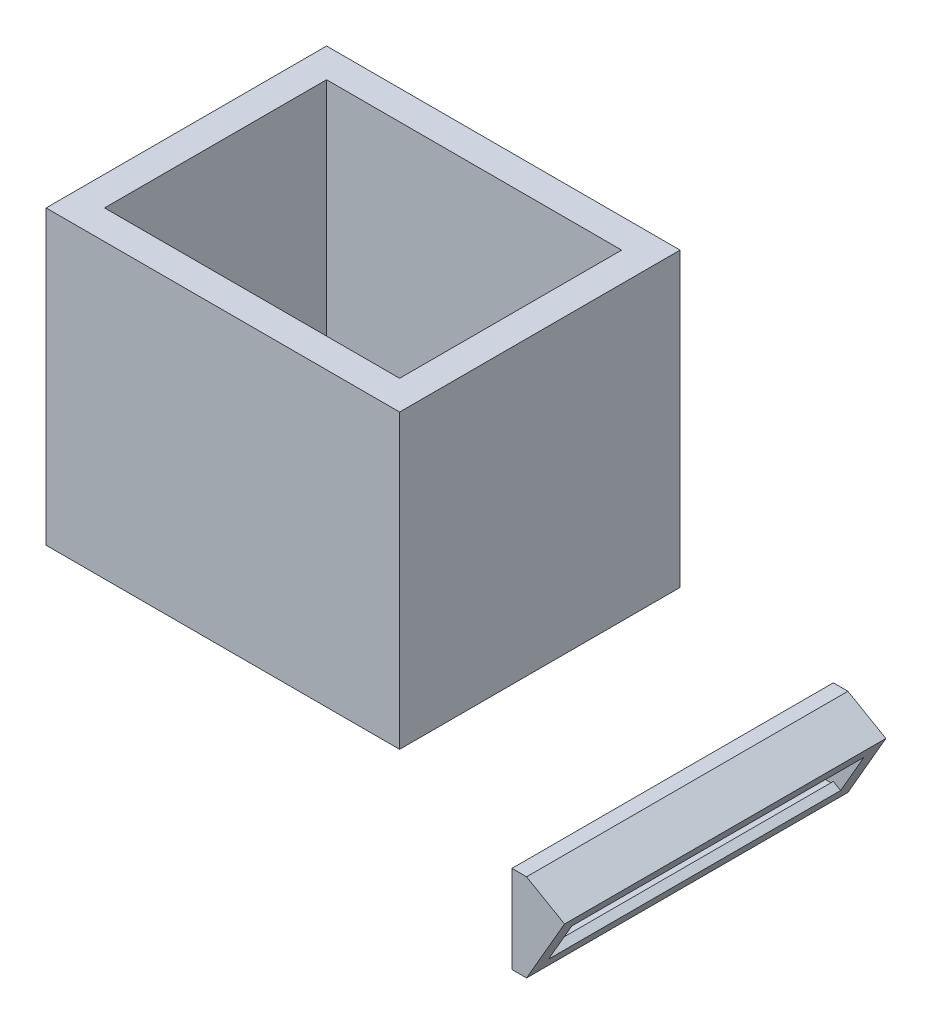
ISO-10303-21;
HEADER;
FILE_DESCRIPTION(('STEP AP214'),'2;1');
FILE_NAME('part.step','',(''),(''),'','','');
FILE_SCHEMA(('AUTOMOTIVE_DESIGN { 1 0 10303 214 1 1 1 1 }'));
ENDSEC;
DATA;
#1=APPLICATION_CONTEXT('core data for automotive mechanical design processes');
#2=APPLICATION_PROTOCOL_DEFINITION('international standard','automotive_design',2000,#1);
#3=PRODUCT_CONTEXT('',#1,'mechanical');
#4=PRODUCT('Part','Part','',(#3));
#5=PRODUCT_RELATED_PRODUCT_CATEGORY('part','',(#4));
#6=PRODUCT_DEFINITION_FORMATION('','',#4);
#7=PRODUCT_DEFINITION_CONTEXT('part definition',#1,'design');
#8=PRODUCT_DEFINITION('design','',#6,#7);
#9=PRODUCT_DEFINITION_SHAPE('','',#8);
#10=(LENGTH_UNIT() NAMED_UNIT(*) SI_UNIT(.MILLI.,.METRE.));
#11=(NAMED_UNIT(*) PLANE_ANGLE_UNIT() SI_UNIT($,.RADIAN.));
#12=(NAMED_UNIT(*) SI_UNIT($,.STERADIAN.) SOLID_ANGLE_UNIT());
#13=UNCERTAINTY_MEASURE_WITH_UNIT(LENGTH_MEASURE(1.E-05),#10,'distance_accuracy_value','');
#14=(GEOMETRIC_REPRESENTATION_CONTEXT(3) GLOBAL_UNCERTAINTY_ASSIGNED_CONTEXT((#13)) GLOBAL_UNIT_ASSIGNED_CONTEXT((#10,
#11,#12)) REPRESENTATION_CONTEXT('',''));
#15=CARTESIAN_POINT('',(0.,0.,0.));
#16=DIRECTION('',(0.,0.,1.));
#17=DIRECTION('',(1.,0.,0.));
#18=AXIS2_PLACEMENT_3D('',#15,#16,#17);
#19=CARTESIAN_POINT('',(3.,0.,0.));
#20=DIRECTION('',(-1.,0.,0.));
#21=DIRECTION('',(0.,0.,1.));
#22=AXIS2_PLACEMENT_3D('',#19,#20,#21);
#23=PLANE('',#22);
#24=DIRECTION('',(0.,1.,0.));
#25=VECTOR('',#24,1.);
#26=CARTESIAN_POINT('',(3.,-26.,-29.1899634390391));
#27=LINE('',#26,#25);
#28=CARTESIAN_POINT('',(3.,-26.,-29.1899634390391));
#29=VERTEX_POINT('',#28);
#30=CARTESIAN_POINT('',(3.,-20.,-29.1899634390391));
#31=VERTEX_POINT('',#30);
#32=EDGE_CURVE('E171',#29,#31,#27,.T.);
#33=ORIENTED_EDGE('',*,*,#32,.F.);
#34=DIRECTION('',(0.,0.,-1.));
#35=VECTOR('',#34,1.);
#36=CARTESIAN_POINT('',(3.,-26.,-7.1899634390391));
#37=LINE('',#36,#35);
#38=CARTESIAN_POINT('',(3.,-26.,-7.1899634390391));
#39=VERTEX_POINT('',#38);
#40=EDGE_CURVE('E87',#39,#29,#37,.T.);
#41=ORIENTED_EDGE('',*,*,#40,.F.);
#42=DIRECTION('',(0.,-1.,0.));
#43=VECTOR('',#42,1.);
#44=CARTESIAN_POINT('',(3.,-26.,-7.1899634390391));
#45=LINE('',#44,#43);
#46=CARTESIAN_POINT('',(3.,-20.,-7.1899634390391));
#47=VERTEX_POINT('',#46);
#48=EDGE_CURVE('E176',#47,#39,#45,.T.);
#49=ORIENTED_EDGE('',*,*,#48,.F.);
#50=DIRECTION('',(0.,0.,1.));
#51=VECTOR('',#50,1.);
#52=CARTESIAN_POINT('',(3.,-20.,-7.1899634390391));
#53=LINE('',#52,#51);
#54=EDGE_CURVE('E173',#31,#47,#53,.T.);
#55=ORIENTED_EDGE('',*,*,#54,.F.);
#56=EDGE_LOOP('',(#33,#41,#49,#55));
#57=FACE_BOUND('',#56,.T.);
#58=DIRECTION('',(0.,0.,-1.));
#59=VECTOR('',#58,1.);
#60=CARTESIAN_POINT('',(3.,-25.,-8.18996343903912));
#61=LINE('',#60,#59);
#62=CARTESIAN_POINT('',(3.,-25.,-8.18996343903912));
#63=VERTEX_POINT('',#62);
#64=CARTESIAN_POINT('',(3.,-25.,-28.1899634390391));
#65=VERTEX_POINT('',#64);
#66=EDGE_CURVE('E228',#63,#65,#61,.T.);
#67=ORIENTED_EDGE('',*,*,#66,.T.);
#68=DIRECTION('',(0.,1.,0.));
#69=VECTOR('',#68,1.);
#70=CARTESIAN_POINT('',(3.,-25.,-28.1899634390391));
#71=LINE('',#70,#69);
#72=CARTESIAN_POINT('',(3.,-21.,-28.1899634390391));
#73=VERTEX_POINT('',#72);
#74=EDGE_CURVE('E58',#65,#73,#71,.T.);
#75=ORIENTED_EDGE('',*,*,#74,.T.);
#76=DIRECTION('',(0.,0.,1.));
#77=VECTOR('',#76,1.);
#78=CARTESIAN_POINT('',(3.,-21.,-8.18996343903912));
#79=LINE('',#78,#77);
#80=CARTESIAN_POINT('',(3.,-21.,-8.18996343903912));
#81=VERTEX_POINT('',#80);
#82=EDGE_CURVE('E222',#73,#81,#79,.T.);
#83=ORIENTED_EDGE('',*,*,#82,.T.);
#84=DIRECTION('',(0.,-1.,0.));
#85=VECTOR('',#84,1.);
#86=CARTESIAN_POINT('',(3.,-25.,-8.18996343903912));
#87=LINE('',#86,#85);
#88=EDGE_CURVE('E225',#81,#63,#87,.T.);
#89=ORIENTED_EDGE('',*,*,#88,.T.);
#90=EDGE_LOOP('',(#67,#75,#83,#89));
#91=FACE_BOUND('',#90,.T.);
#92=ADVANCED_FACE('F43',(#57,#91),#23,.T.);
#93=CARTESIAN_POINT('',(4.,-26.,-29.1899634390391));
#94=DIRECTION('',(0.,0.,1.));
#95=DIRECTION('',(1.,0.,0.));
#96=AXIS2_PLACEMENT_3D('',#93,#94,#95);
#97=PLANE('',#96);
#98=ORIENTED_EDGE('',*,*,#32,.T.);
#99=DIRECTION('',(-1.,0.,0.));
#100=VECTOR('',#99,1.);
#101=CARTESIAN_POINT('',(4.,-20.,-29.1899634390391));
#102=LINE('',#101,#100);
#103=CARTESIAN_POINT('',(4.,-20.,-29.1899634390391));
#104=VERTEX_POINT('',#103);
#105=EDGE_CURVE('E12',#104,#31,#102,.T.);
#106=ORIENTED_EDGE('',*,*,#105,.F.);
#107=DIRECTION('',(0.866025403784438,-0.500000000000001,0.));
#108=VECTOR('',#107,1.);
#109=CARTESIAN_POINT('',(-15.7920024250066,-8.57308207212069,-29.1899634390391));
#110=LINE('',#109,#108);
#111=CARTESIAN_POINT('',(6.59807621135332,-21.5,-29.1899634390391));
#112=VERTEX_POINT('',#111);
#113=EDGE_CURVE('E159',#104,#112,#110,.T.);
#114=ORIENTED_EDGE('',*,*,#113,.T.);
#115=DIRECTION('',(0.500000000000001,0.866025403784438,0.));
#116=VECTOR('',#115,1.);
#117=CARTESIAN_POINT('',(4.,-26.,-29.1899634390391));
#118=LINE('',#117,#116);
#119=CARTESIAN_POINT('',(4.,-26.,-29.1899634390391));
#120=VERTEX_POINT('',#119);
#121=EDGE_CURVE('E157',#120,#112,#118,.T.);
#122=ORIENTED_EDGE('',*,*,#121,.F.);
#123=DIRECTION('',(-1.,0.,0.));
#124=VECTOR('',#123,1.);
#125=CARTESIAN_POINT('',(4.,-26.,-29.1899634390391));
#126=LINE('',#125,#124);
#127=EDGE_CURVE('E146',#120,#29,#126,.T.);
#128=ORIENTED_EDGE('',*,*,#127,.T.);
#129=EDGE_LOOP('',(#98,#106,#114,#122,#128));
#130=FACE_BOUND('',#129,.T.);
#131=ADVANCED_FACE('F45',(#130),#97,.F.);
#132=CARTESIAN_POINT('',(4.,-20.,-7.1899634390391));
#133=DIRECTION('',(0.,-1.,0.));
#134=DIRECTION('',(0.,0.,-1.));
#135=AXIS2_PLACEMENT_3D('',#132,#133,#134);
#136=PLANE('',#135);
#137=ORIENTED_EDGE('',*,*,#54,.T.);
#138=DIRECTION('',(-1.,0.,0.));
#139=VECTOR('',#138,1.);
#140=CARTESIAN_POINT('',(4.,-20.,-7.1899634390391));
#141=LINE('',#140,#139);
#142=CARTESIAN_POINT('',(4.,-20.,-7.1899634390391));
#143=VERTEX_POINT('',#142);
#144=EDGE_CURVE('E51',#143,#47,#141,.T.);
#145=ORIENTED_EDGE('',*,*,#144,.F.);
#146=DIRECTION('',(0.,0.,1.));
#147=VECTOR('',#146,1.);
#148=CARTESIAN_POINT('',(4.,-20.,-7.1899634390391));
#149=LINE('',#148,#147);
#150=EDGE_CURVE('E92',#104,#143,#149,.T.);
#151=ORIENTED_EDGE('',*,*,#150,.F.);
#152=ORIENTED_EDGE('',*,*,#105,.T.);
#153=EDGE_LOOP('',(#137,#145,#151,#152));
#154=FACE_BOUND('',#153,.T.);
#155=ADVANCED_FACE('F291',(#154),#136,.F.);
#156=CARTESIAN_POINT('',(4.,-26.,-7.1899634390391));
#157=DIRECTION('',(0.,0.,-1.));
#158=DIRECTION('',(0.,1.,0.));
#159=AXIS2_PLACEMENT_3D('',#156,#157,#158);
#160=PLANE('',#159);
#161=ORIENTED_EDGE('',*,*,#48,.T.);
#162=DIRECTION('',(-1.,0.,0.));
#163=VECTOR('',#162,1.);
#164=CARTESIAN_POINT('',(4.,-26.,-7.1899634390391));
#165=LINE('',#164,#163);
#166=CARTESIAN_POINT('',(4.,-26.,-7.1899634390391));
#167=VERTEX_POINT('',#166);
#168=EDGE_CURVE('E67',#167,#39,#165,.T.);
#169=ORIENTED_EDGE('',*,*,#168,.F.);
#170=DIRECTION('',(-0.500000000000001,-0.866025403784438,0.));
#171=VECTOR('',#170,1.);
#172=CARTESIAN_POINT('',(4.,-26.,-7.1899634390391));
#173=LINE('',#172,#171);
#174=CARTESIAN_POINT('',(6.59807621135332,-21.5,-7.1899634390391));
#175=VERTEX_POINT('',#174);
#176=EDGE_CURVE('E164',#175,#167,#173,.T.);
#177=ORIENTED_EDGE('',*,*,#176,.F.);
#178=DIRECTION('',(0.866025403784438,-0.500000000000001,0.));
#179=VECTOR('',#178,1.);
#180=CARTESIAN_POINT('',(-15.7920024250066,-8.57308207212069,-7.18996343903911));
#181=LINE('',#180,#179);
#182=EDGE_CURVE('E183',#143,#175,#181,.T.);
#183=ORIENTED_EDGE('',*,*,#182,.F.);
#184=ORIENTED_EDGE('',*,*,#144,.T.);
#185=EDGE_LOOP('',(#161,#169,#177,#183,#184));
#186=FACE_BOUND('',#185,.T.);
#187=ADVANCED_FACE('F182',(#186),#160,.F.);
#188=CARTESIAN_POINT('',(4.,-26.,-7.1899634390391));
#189=DIRECTION('',(0.,1.,0.));
#190=DIRECTION('',(0.,0.,1.));
#191=AXIS2_PLACEMENT_3D('',#188,#189,#190);
#192=PLANE('',#191);
#193=ORIENTED_EDGE('',*,*,#40,.T.);
#194=ORIENTED_EDGE('',*,*,#127,.F.);
#195=DIRECTION('',(0.,0.,-1.));
#196=VECTOR('',#195,1.);
#197=CARTESIAN_POINT('',(4.,-26.,-7.1899634390391));
#198=LINE('',#197,#196);
#199=EDGE_CURVE('E150',#167,#120,#198,.T.);
#200=ORIENTED_EDGE('',*,*,#199,.F.);
#201=ORIENTED_EDGE('',*,*,#168,.T.);
#202=EDGE_LOOP('',(#193,#194,#200,#201));
#203=FACE_BOUND('',#202,.T.);
#204=ADVANCED_FACE('F148',(#203),#192,.F.);
#205=CARTESIAN_POINT('',(4.,-25.,-28.1899634390391));
#206=DIRECTION('',(0.,0.,1.));
#207=DIRECTION('',(1.,0.,0.));
#208=AXIS2_PLACEMENT_3D('',#205,#206,#207);
#209=PLANE('',#208);
#210=ORIENTED_EDGE('',*,*,#74,.F.);
#211=DIRECTION('',(-1.,0.,0.));
#212=VECTOR('',#211,1.);
#213=CARTESIAN_POINT('',(4.,-25.,-28.1899634390391));
#214=LINE('',#213,#212);
#215=CARTESIAN_POINT('',(4.,-25.,-28.1899634390391));
#216=VERTEX_POINT('',#215);
#217=EDGE_CURVE('E220',#216,#65,#214,.T.);
#218=ORIENTED_EDGE('',*,*,#217,.F.);
#219=DIRECTION('',(0.,1.,0.));
#220=VECTOR('',#219,1.);
#221=CARTESIAN_POINT('',(4.,-25.,-28.1899634390391));
#222=LINE('',#221,#220);
#223=CARTESIAN_POINT('',(4.,-24.8452994616208,-28.1899634390391));
#224=VERTEX_POINT('',#223);
#225=EDGE_CURVE('E206',#216,#224,#222,.T.);
#226=ORIENTED_EDGE('',*,*,#225,.T.);
#227=DIRECTION('',(0.866025403784438,-0.500000000000001,0.));
#228=VECTOR('',#227,1.);
#229=CARTESIAN_POINT('',(-17.8900786363599,-12.2070566683362,-28.1899634390391));
#230=LINE('',#229,#228);
#231=CARTESIAN_POINT('',(4.5,-25.1339745962156,-28.1899634390391));
#232=VERTEX_POINT('',#231);
#233=EDGE_CURVE('E200',#224,#232,#230,.T.);
#234=ORIENTED_EDGE('',*,*,#233,.T.);
#235=DIRECTION('',(0.500000000000001,0.866025403784438,0.));
#236=VECTOR('',#235,1.);
#237=CARTESIAN_POINT('',(4.5,-25.1339745962156,-28.1899634390391));
#238=LINE('',#237,#236);
#239=CARTESIAN_POINT('',(6.09807621135332,-22.3660254037844,-28.1899634390391));
#240=VERTEX_POINT('',#239);
#241=EDGE_CURVE('E199',#232,#240,#238,.T.);
#242=ORIENTED_EDGE('',*,*,#241,.T.);
#243=DIRECTION('',(0.866025403784438,-0.500000000000001,0.));
#244=VECTOR('',#243,1.);
#245=CARTESIAN_POINT('',(-16.2920024250066,-9.43910747590512,-28.1899634390391));
#246=LINE('',#245,#244);
#247=CARTESIAN_POINT('',(4.,-21.1547005383792,-28.1899634390391));
#248=VERTEX_POINT('',#247);
#249=EDGE_CURVE('E197',#248,#240,#246,.T.);
#250=ORIENTED_EDGE('',*,*,#249,.F.);
#251=CARTESIAN_POINT('',(4.,-21.,-28.1899634390391));
#252=VERTEX_POINT('',#251);
#253=EDGE_CURVE('E210',#248,#252,#222,.T.);
#254=ORIENTED_EDGE('',*,*,#253,.T.);
#255=DIRECTION('',(-1.,0.,0.));
#256=VECTOR('',#255,1.);
#257=CARTESIAN_POINT('',(4.,-21.,-28.1899634390391));
#258=LINE('',#257,#256);
#259=EDGE_CURVE('E174',#252,#73,#258,.T.);
#260=ORIENTED_EDGE('',*,*,#259,.T.);
#261=EDGE_LOOP('',(#210,#218,#226,#234,#242,#250,#254,#260));
#262=FACE_BOUND('',#261,.T.);
#263=ADVANCED_FACE('F237',(#262),#209,.T.);
#264=CARTESIAN_POINT('',(4.,-21.,-8.18996343903912));
#265=DIRECTION('',(0.,-1.,0.));
#266=DIRECTION('',(0.,0.,-1.));
#267=AXIS2_PLACEMENT_3D('',#264,#265,#266);
#268=PLANE('',#267);
#269=ORIENTED_EDGE('',*,*,#82,.F.);
#270=ORIENTED_EDGE('',*,*,#259,.F.);
#271=DIRECTION('',(0.,0.,1.));
#272=VECTOR('',#271,1.);
#273=CARTESIAN_POINT('',(4.,-21.,-8.18996343903912));
#274=LINE('',#273,#272);
#275=CARTESIAN_POINT('',(4.,-21.,-8.18996343903912));
#276=VERTEX_POINT('',#275);
#277=EDGE_CURVE('E209',#252,#276,#274,.T.);
#278=ORIENTED_EDGE('',*,*,#277,.T.);
#279=DIRECTION('',(-1.,0.,0.));
#280=VECTOR('',#279,1.);
#281=CARTESIAN_POINT('',(4.,-21.,-8.18996343903912));
#282=LINE('',#281,#280);
#283=EDGE_CURVE('E234',#276,#81,#282,.T.);
#284=ORIENTED_EDGE('',*,*,#283,.T.);
#285=EDGE_LOOP('',(#269,#270,#278,#284));
#286=FACE_BOUND('',#285,.T.);
#287=ADVANCED_FACE('F277',(#286),#268,.T.);
#288=CARTESIAN_POINT('',(4.,-25.,-8.18996343903912));
#289=DIRECTION('',(0.,0.,-1.));
#290=DIRECTION('',(-1.,0.,0.));
#291=AXIS2_PLACEMENT_3D('',#288,#289,#290);
#292=PLANE('',#291);
#293=ORIENTED_EDGE('',*,*,#88,.F.);
#294=ORIENTED_EDGE('',*,*,#283,.F.);
#295=DIRECTION('',(0.,-1.,0.));
#296=VECTOR('',#295,1.);
#297=CARTESIAN_POINT('',(4.,-25.,-8.18996343903912));
#298=LINE('',#297,#296);
#299=CARTESIAN_POINT('',(4.,-21.1547005383792,-8.1899634390391));
#300=VERTEX_POINT('',#299);
#301=EDGE_CURVE('E214',#276,#300,#298,.T.);
#302=ORIENTED_EDGE('',*,*,#301,.T.);
#303=DIRECTION('',(0.866025403784438,-0.500000000000001,0.));
#304=VECTOR('',#303,1.);
#305=CARTESIAN_POINT('',(-16.2920024250066,-9.43910747590512,-8.1899634390391));
#306=LINE('',#305,#304);
#307=CARTESIAN_POINT('',(6.09807621135332,-22.3660254037844,-8.1899634390391));
#308=VERTEX_POINT('',#307);
#309=EDGE_CURVE('E193',#300,#308,#306,.T.);
#310=ORIENTED_EDGE('',*,*,#309,.T.);
#311=DIRECTION('',(-0.500000000000002,-0.866025403784438,0.));
#312=VECTOR('',#311,1.);
#313=CARTESIAN_POINT('',(4.5,-25.1339745962156,-8.1899634390391));
#314=LINE('',#313,#312);
#315=CARTESIAN_POINT('',(4.5,-25.1339745962156,-8.1899634390391));
#316=VERTEX_POINT('',#315);
#317=EDGE_CURVE('E195',#308,#316,#314,.T.);
#318=ORIENTED_EDGE('',*,*,#317,.T.);
#319=DIRECTION('',(0.866025403784438,-0.500000000000001,0.));
#320=VECTOR('',#319,1.);
#321=CARTESIAN_POINT('',(-17.8900786363599,-12.2070566683362,-8.1899634390391));
#322=LINE('',#321,#320);
#323=CARTESIAN_POINT('',(4.,-24.8452994616207,-8.1899634390391));
#324=VERTEX_POINT('',#323);
#325=EDGE_CURVE('E203',#324,#316,#322,.T.);
#326=ORIENTED_EDGE('',*,*,#325,.F.);
#327=CARTESIAN_POINT('',(4.,-25.,-8.18996343903912));
#328=VERTEX_POINT('',#327);
#329=EDGE_CURVE('E213',#324,#328,#298,.T.);
#330=ORIENTED_EDGE('',*,*,#329,.T.);
#331=DIRECTION('',(-1.,0.,0.));
#332=VECTOR('',#331,1.);
#333=CARTESIAN_POINT('',(4.,-25.,-8.18996343903912));
#334=LINE('',#333,#332);
#335=EDGE_CURVE('E232',#328,#63,#334,.T.);
#336=ORIENTED_EDGE('',*,*,#335,.T.);
#337=EDGE_LOOP('',(#293,#294,#302,#310,#318,#326,#330,#336));
#338=FACE_BOUND('',#337,.T.);
#339=ADVANCED_FACE('F273',(#338),#292,.T.);
#340=CARTESIAN_POINT('',(4.,-25.,-8.18996343903912));
#341=DIRECTION('',(0.,1.,0.));
#342=DIRECTION('',(0.,0.,1.));
#343=AXIS2_PLACEMENT_3D('',#340,#341,#342);
#344=PLANE('',#343);
#345=ORIENTED_EDGE('',*,*,#66,.F.);
#346=ORIENTED_EDGE('',*,*,#335,.F.);
#347=DIRECTION('',(0.,0.,-1.));
#348=VECTOR('',#347,1.);
#349=CARTESIAN_POINT('',(4.,-25.,-8.18996343903912));
#350=LINE('',#349,#348);
#351=EDGE_CURVE('E217',#328,#216,#350,.T.);
#352=ORIENTED_EDGE('',*,*,#351,.T.);
#353=ORIENTED_EDGE('',*,*,#217,.T.);
#354=EDGE_LOOP('',(#345,#346,#352,#353));
#355=FACE_BOUND('',#354,.T.);
#356=ADVANCED_FACE('F244',(#355),#344,.T.);
#357=CARTESIAN_POINT('',(4.,0.,0.));
#358=DIRECTION('',(-1.,0.,0.));
#359=DIRECTION('',(0.,0.,1.));
#360=AXIS2_PLACEMENT_3D('',#357,#358,#359);
#361=PLANE('',#360);
#362=ORIENTED_EDGE('',*,*,#225,.F.);
#363=ORIENTED_EDGE('',*,*,#351,.F.);
#364=ORIENTED_EDGE('',*,*,#329,.F.);
#365=DIRECTION('',(0.,0.,-1.));
#366=VECTOR('',#365,1.);
#367=CARTESIAN_POINT('',(4.,-24.8452994616207,-8.1899634390391));
#368=LINE('',#367,#366);
#369=EDGE_CURVE('E205',#324,#224,#368,.T.);
#370=ORIENTED_EDGE('',*,*,#369,.T.);
#371=EDGE_LOOP('',(#362,#363,#364,#370));
#372=FACE_BOUND('',#371,.T.);
#373=ADVANCED_FACE('F249',(#372),#361,.T.);
#374=ORIENTED_EDGE('',*,*,#253,.F.);
#375=DIRECTION('',(0.,0.,1.));
#376=VECTOR('',#375,1.);
#377=CARTESIAN_POINT('',(4.,-21.1547005383792,-8.1899634390391));
#378=LINE('',#377,#376);
#379=EDGE_CURVE('E254',#248,#300,#378,.T.);
#380=ORIENTED_EDGE('',*,*,#379,.T.);
#381=ORIENTED_EDGE('',*,*,#301,.F.);
#382=ORIENTED_EDGE('',*,*,#277,.F.);
#383=EDGE_LOOP('',(#374,#380,#381,#382));
#384=FACE_BOUND('',#383,.T.);
#385=ADVANCED_FACE('F276',(#384),#361,.T.);
#386=CARTESIAN_POINT('',(-17.8900786363599,-12.2070566683362,-8.1899634390391));
#387=DIRECTION('',(-0.500000000000001,-0.866025403784438,0.));
#388=DIRECTION('',(0.866025403784438,-0.500000000000001,0.));
#389=AXIS2_PLACEMENT_3D('',#386,#387,#388);
#390=PLANE('',#389);
#391=ORIENTED_EDGE('',*,*,#369,.F.);
#392=ORIENTED_EDGE('',*,*,#325,.T.);
#393=DIRECTION('',(0.,0.,-1.));
#394=VECTOR('',#393,1.);
#395=CARTESIAN_POINT('',(4.5,-25.1339745962156,-8.1899634390391));
#396=LINE('',#395,#394);
#397=EDGE_CURVE('E202',#316,#232,#396,.T.);
#398=ORIENTED_EDGE('',*,*,#397,.T.);
#399=ORIENTED_EDGE('',*,*,#233,.F.);
#400=EDGE_LOOP('',(#391,#392,#398,#399));
#401=FACE_BOUND('',#400,.T.);
#402=ADVANCED_FACE('F351',(#401),#390,.F.);
#403=CARTESIAN_POINT('',(-16.2920024250066,-9.43910747590512,-8.1899634390391));
#404=DIRECTION('',(0.500000000000001,0.866025403784438,0.));
#405=DIRECTION('',(-0.866025403784438,0.500000000000001,0.));
#406=AXIS2_PLACEMENT_3D('',#403,#404,#405);
#407=PLANE('',#406);
#408=ORIENTED_EDGE('',*,*,#379,.F.);
#409=ORIENTED_EDGE('',*,*,#249,.T.);
#410=DIRECTION('',(0.,0.,1.));
#411=VECTOR('',#410,1.);
#412=CARTESIAN_POINT('',(6.09807621135332,-22.3660254037844,-8.1899634390391));
#413=LINE('',#412,#411);
#414=EDGE_CURVE('E196',#240,#308,#413,.T.);
#415=ORIENTED_EDGE('',*,*,#414,.T.);
#416=ORIENTED_EDGE('',*,*,#309,.F.);
#417=EDGE_LOOP('',(#408,#409,#415,#416));
#418=FACE_BOUND('',#417,.T.);
#419=ADVANCED_FACE('F268',(#418),#407,.F.);
#420=CARTESIAN_POINT('',(14.2583302491977,-8.23205080756891,0.));
#421=DIRECTION('',(-0.866025403784438,0.500000000000001,0.));
#422=DIRECTION('',(-0.500000000000001,-0.866025403784438,0.));
#423=AXIS2_PLACEMENT_3D('',#420,#421,#422);
#424=PLANE('',#423);
#425=ORIENTED_EDGE('',*,*,#397,.F.);
#426=ORIENTED_EDGE('',*,*,#317,.F.);
#427=ORIENTED_EDGE('',*,*,#414,.F.);
#428=ORIENTED_EDGE('',*,*,#241,.F.);
#429=EDGE_LOOP('',(#425,#426,#427,#428));
#430=FACE_BOUND('',#429,.T.);
#431=ORIENTED_EDGE('',*,*,#176,.T.);
#432=ORIENTED_EDGE('',*,*,#199,.T.);
#433=ORIENTED_EDGE('',*,*,#121,.T.);
#434=DIRECTION('',(0.,0.,1.));
#435=VECTOR('',#434,1.);
#436=CARTESIAN_POINT('',(6.59807621135332,-21.5,-7.1899634390391));
#437=LINE('',#436,#435);
#438=EDGE_CURVE('E163',#112,#175,#437,.T.);
#439=ORIENTED_EDGE('',*,*,#438,.T.);
#440=EDGE_LOOP('',(#431,#432,#433,#439));
#441=FACE_BOUND('',#440,.T.);
#442=ADVANCED_FACE('F166',(#430,#441),#424,.F.);
#443=CARTESIAN_POINT('',(-15.7920024250066,-8.57308207212069,-7.18996343903911));
#444=DIRECTION('',(0.500000000000001,0.866025403784438,0.));
#445=DIRECTION('',(-0.866025403784438,0.500000000000001,0.));
#446=AXIS2_PLACEMENT_3D('',#443,#444,#445);
#447=PLANE('',#446);
#448=ORIENTED_EDGE('',*,*,#113,.F.);
#449=ORIENTED_EDGE('',*,*,#150,.T.);
#450=ORIENTED_EDGE('',*,*,#182,.T.);
#451=ORIENTED_EDGE('',*,*,#438,.F.);
#452=EDGE_LOOP('',(#448,#449,#450,#451));
#453=FACE_BOUND('',#452,.T.);
#454=ADVANCED_FACE('F187',(#453),#447,.T.);
#455=CLOSED_SHELL('',(#92,#131,#155,#187,#204,#263,#287,#339,#356,#373,#385,#402,#419,#442,#454));
#456=MANIFOLD_SOLID_BREP('B2',#455);
#457=CARTESIAN_POINT('',(0.,20.,0.));
#458=DIRECTION('',(0.,-1.,0.));
#459=DIRECTION('',(0.,0.,-1.));
#460=AXIS2_PLACEMENT_3D('',#457,#458,#459);
#461=PLANE('',#460);
#462=DIRECTION('',(0.,0.,-1.));
#463=VECTOR('',#462,1.);
#464=CARTESIAN_POINT('',(12.1,20.,9.6));
#465=LINE('',#464,#463);
#466=CARTESIAN_POINT('',(12.1,20.,9.6));
#467=VERTEX_POINT('',#466);
#468=CARTESIAN_POINT('',(12.1,20.,-9.6));
#469=VERTEX_POINT('',#468);
#470=EDGE_CURVE('E512',#467,#469,#465,.T.);
#471=ORIENTED_EDGE('',*,*,#470,.T.);
#472=DIRECTION('',(-1.,0.,0.));
#473=VECTOR('',#472,1.);
#474=CARTESIAN_POINT('',(-12.1,20.,-9.6));
#475=LINE('',#474,#473);
#476=CARTESIAN_POINT('',(-12.1,20.,-9.6));
#477=VERTEX_POINT('',#476);
#478=EDGE_CURVE('E515',#469,#477,#475,.T.);
#479=ORIENTED_EDGE('',*,*,#478,.T.);
#480=DIRECTION('',(0.,0.,1.));
#481=VECTOR('',#480,1.);
#482=CARTESIAN_POINT('',(-12.1,20.,9.6));
#483=LINE('',#482,#481);
#484=CARTESIAN_POINT('',(-12.1,20.,9.6));
#485=VERTEX_POINT('',#484);
#486=EDGE_CURVE('E518',#477,#485,#483,.T.);
#487=ORIENTED_EDGE('',*,*,#486,.T.);
#488=DIRECTION('',(1.,0.,0.));
#489=VECTOR('',#488,1.);
#490=CARTESIAN_POINT('',(-12.1,20.,9.6));
#491=LINE('',#490,#489);
#492=EDGE_CURVE('E520',#485,#467,#491,.T.);
#493=ORIENTED_EDGE('',*,*,#492,.T.);
#494=EDGE_LOOP('',(#471,#479,#487,#493));
#495=FACE_BOUND('',#494,.T.);
#496=DIRECTION('',(0.,0.,-1.));
#497=VECTOR('',#496,1.);
#498=CARTESIAN_POINT('',(10.1,20.,7.6));
#499=LINE('',#498,#497);
#500=CARTESIAN_POINT('',(10.1,20.,7.6));
#501=VERTEX_POINT('',#500);
#502=CARTESIAN_POINT('',(10.1,20.,-7.6));
#503=VERTEX_POINT('',#502);
#504=EDGE_CURVE('E476',#501,#503,#499,.T.);
#505=ORIENTED_EDGE('',*,*,#504,.F.);
#506=DIRECTION('',(1.,0.,0.));
#507=VECTOR('',#506,1.);
#508=CARTESIAN_POINT('',(-10.1,20.,7.6));
#509=LINE('',#508,#507);
#510=CARTESIAN_POINT('',(-10.1,20.,7.6));
#511=VERTEX_POINT('',#510);
#512=EDGE_CURVE('E498',#511,#501,#509,.T.);
#513=ORIENTED_EDGE('',*,*,#512,.F.);
#514=DIRECTION('',(0.,0.,1.));
#515=VECTOR('',#514,1.);
#516=CARTESIAN_POINT('',(-10.1,20.,7.6));
#517=LINE('',#516,#515);
#518=CARTESIAN_POINT('',(-10.1,20.,-7.6));
#519=VERTEX_POINT('',#518);
#520=EDGE_CURVE('E496',#519,#511,#517,.T.);
#521=ORIENTED_EDGE('',*,*,#520,.F.);
#522=DIRECTION('',(-1.,0.,0.));
#523=VECTOR('',#522,1.);
#524=CARTESIAN_POINT('',(-10.1,20.,-7.6));
#525=LINE('',#524,#523);
#526=EDGE_CURVE('E484',#503,#519,#525,.T.);
#527=ORIENTED_EDGE('',*,*,#526,.F.);
#528=EDGE_LOOP('',(#505,#513,#521,#527));
#529=FACE_BOUND('',#528,.T.);
#530=ADVANCED_FACE('F411',(#495,#529),#461,.F.);
#531=CARTESIAN_POINT('',(0.,0.,0.));
#532=DIRECTION('',(0.,-1.,0.));
#533=DIRECTION('',(0.,0.,-1.));
#534=AXIS2_PLACEMENT_3D('',#531,#532,#533);
#535=PLANE('',#534);
#536=DIRECTION('',(0.,0.,-1.));
#537=VECTOR('',#536,1.);
#538=CARTESIAN_POINT('',(12.1,0.,9.6));
#539=LINE('',#538,#537);
#540=CARTESIAN_POINT('',(12.1,0.,9.6));
#541=VERTEX_POINT('',#540);
#542=CARTESIAN_POINT('',(12.1,0.,-9.6));
#543=VERTEX_POINT('',#542);
#544=EDGE_CURVE('E492',#541,#543,#539,.T.);
#545=ORIENTED_EDGE('',*,*,#544,.F.);
#546=DIRECTION('',(1.,0.,0.));
#547=VECTOR('',#546,1.);
#548=CARTESIAN_POINT('',(-12.1,0.,9.6));
#549=LINE('',#548,#547);
#550=CARTESIAN_POINT('',(-12.1,0.,9.6));
#551=VERTEX_POINT('',#550);
#552=EDGE_CURVE('E516',#551,#541,#549,.T.);
#553=ORIENTED_EDGE('',*,*,#552,.F.);
#554=DIRECTION('',(0.,0.,1.));
#555=VECTOR('',#554,1.);
#556=CARTESIAN_POINT('',(-12.1,0.,9.6));
#557=LINE('',#556,#555);
#558=CARTESIAN_POINT('',(-12.1,0.,-9.6));
#559=VERTEX_POINT('',#558);
#560=EDGE_CURVE('E527',#559,#551,#557,.T.);
#561=ORIENTED_EDGE('',*,*,#560,.F.);
#562=DIRECTION('',(-1.,0.,0.));
#563=VECTOR('',#562,1.);
#564=CARTESIAN_POINT('',(-12.1,0.,-9.6));
#565=LINE('',#564,#563);
#566=EDGE_CURVE('E525',#543,#559,#565,.T.);
#567=ORIENTED_EDGE('',*,*,#566,.F.);
#568=EDGE_LOOP('',(#545,#553,#561,#567));
#569=FACE_BOUND('',#568,.T.);
#570=DIRECTION('',(1.,0.,0.));
#571=VECTOR('',#570,1.);
#572=CARTESIAN_POINT('',(-10.1,0.,7.6));
#573=LINE('',#572,#571);
#574=CARTESIAN_POINT('',(-10.1,0.,7.6));
#575=VERTEX_POINT('',#574);
#576=CARTESIAN_POINT('',(10.1,0.,7.6));
#577=VERTEX_POINT('',#576);
#578=EDGE_CURVE('E485',#575,#577,#573,.T.);
#579=ORIENTED_EDGE('',*,*,#578,.T.);
#580=DIRECTION('',(0.,0.,-1.));
#581=VECTOR('',#580,1.);
#582=CARTESIAN_POINT('',(10.1,0.,7.6));
#583=LINE('',#582,#581);
#584=CARTESIAN_POINT('',(10.1,0.,-7.6));
#585=VERTEX_POINT('',#584);
#586=EDGE_CURVE('E434',#577,#585,#583,.T.);
#587=ORIENTED_EDGE('',*,*,#586,.T.);
#588=DIRECTION('',(-1.,0.,0.));
#589=VECTOR('',#588,1.);
#590=CARTESIAN_POINT('',(-10.1,0.,-7.6));
#591=LINE('',#590,#589);
#592=CARTESIAN_POINT('',(-10.1,0.,-7.6));
#593=VERTEX_POINT('',#592);
#594=EDGE_CURVE('E491',#585,#593,#591,.T.);
#595=ORIENTED_EDGE('',*,*,#594,.T.);
#596=DIRECTION('',(0.,0.,1.));
#597=VECTOR('',#596,1.);
#598=CARTESIAN_POINT('',(-10.1,0.,7.6));
#599=LINE('',#598,#597);
#600=EDGE_CURVE('E504',#593,#575,#599,.T.);
#601=ORIENTED_EDGE('',*,*,#600,.T.);
#602=EDGE_LOOP('',(#579,#587,#595,#601));
#603=FACE_BOUND('',#602,.T.);
#604=ADVANCED_FACE('F545',(#569,#603),#535,.T.);
#605=CARTESIAN_POINT('',(12.1,20.,9.6));
#606=DIRECTION('',(-1.,0.,0.));
#607=DIRECTION('',(0.,0.,1.));
#608=AXIS2_PLACEMENT_3D('',#605,#606,#607);
#609=PLANE('',#608);
#610=ORIENTED_EDGE('',*,*,#544,.T.);
#611=DIRECTION('',(0.,-1.,0.));
#612=VECTOR('',#611,1.);
#613=CARTESIAN_POINT('',(12.1,20.,-9.6));
#614=LINE('',#613,#612);
#615=EDGE_CURVE('E41',#469,#543,#614,.T.);
#616=ORIENTED_EDGE('',*,*,#615,.F.);
#617=ORIENTED_EDGE('',*,*,#470,.F.);
#618=DIRECTION('',(0.,-1.,0.));
#619=VECTOR('',#618,1.);
#620=CARTESIAN_POINT('',(12.1,20.,9.6));
#621=LINE('',#620,#619);
#622=EDGE_CURVE('E522',#467,#541,#621,.T.);
#623=ORIENTED_EDGE('',*,*,#622,.T.);
#624=EDGE_LOOP('',(#610,#616,#617,#623));
#625=FACE_BOUND('',#624,.T.);
#626=ADVANCED_FACE('F413',(#625),#609,.F.);
#627=CARTESIAN_POINT('',(-12.1,20.,-9.6));
#628=DIRECTION('',(0.,0.,1.));
#629=DIRECTION('',(1.,0.,0.));
#630=AXIS2_PLACEMENT_3D('',#627,#628,#629);
#631=PLANE('',#630);
#632=ORIENTED_EDGE('',*,*,#566,.T.);
#633=DIRECTION('',(0.,-1.,0.));
#634=VECTOR('',#633,1.);
#635=CARTESIAN_POINT('',(-12.1,20.,-9.6));
#636=LINE('',#635,#634);
#637=EDGE_CURVE('E419',#477,#559,#636,.T.);
#638=ORIENTED_EDGE('',*,*,#637,.F.);
#639=ORIENTED_EDGE('',*,*,#478,.F.);
#640=ORIENTED_EDGE('',*,*,#615,.T.);
#641=EDGE_LOOP('',(#632,#638,#639,#640));
#642=FACE_BOUND('',#641,.T.);
#643=ADVANCED_FACE('F555',(#642),#631,.F.);
#644=CARTESIAN_POINT('',(-12.1,20.,9.6));
#645=DIRECTION('',(1.,0.,0.));
#646=DIRECTION('',(0.,0.,-1.));
#647=AXIS2_PLACEMENT_3D('',#644,#645,#646);
#648=PLANE('',#647);
#649=ORIENTED_EDGE('',*,*,#560,.T.);
#650=DIRECTION('',(0.,-1.,0.));
#651=VECTOR('',#650,1.);
#652=CARTESIAN_POINT('',(-12.1,20.,9.6));
#653=LINE('',#652,#651);
#654=EDGE_CURVE('E532',#485,#551,#653,.T.);
#655=ORIENTED_EDGE('',*,*,#654,.F.);
#656=ORIENTED_EDGE('',*,*,#486,.F.);
#657=ORIENTED_EDGE('',*,*,#637,.T.);
#658=EDGE_LOOP('',(#649,#655,#656,#657));
#659=FACE_BOUND('',#658,.T.);
#660=ADVANCED_FACE('F539',(#659),#648,.F.);
#661=CARTESIAN_POINT('',(-12.1,20.,9.6));
#662=DIRECTION('',(0.,0.,-1.));
#663=DIRECTION('',(-1.,0.,0.));
#664=AXIS2_PLACEMENT_3D('',#661,#662,#663);
#665=PLANE('',#664);
#666=ORIENTED_EDGE('',*,*,#552,.T.);
#667=ORIENTED_EDGE('',*,*,#622,.F.);
#668=ORIENTED_EDGE('',*,*,#492,.F.);
#669=ORIENTED_EDGE('',*,*,#654,.T.);
#670=EDGE_LOOP('',(#666,#667,#668,#669));
#671=FACE_BOUND('',#670,.T.);
#672=ADVANCED_FACE('F549',(#671),#665,.F.);
#673=CARTESIAN_POINT('',(10.1,20.,7.6));
#674=DIRECTION('',(-1.,0.,0.));
#675=DIRECTION('',(0.,0.,1.));
#676=AXIS2_PLACEMENT_3D('',#673,#674,#675);
#677=PLANE('',#676);
#678=ORIENTED_EDGE('',*,*,#586,.F.);
#679=DIRECTION('',(0.,-1.,0.));
#680=VECTOR('',#679,1.);
#681=CARTESIAN_POINT('',(10.1,20.,7.6));
#682=LINE('',#681,#680);
#683=EDGE_CURVE('E480',#501,#577,#682,.T.);
#684=ORIENTED_EDGE('',*,*,#683,.F.);
#685=ORIENTED_EDGE('',*,*,#504,.T.);
#686=DIRECTION('',(0.,-1.,0.));
#687=VECTOR('',#686,1.);
#688=CARTESIAN_POINT('',(10.1,20.,-7.6));
#689=LINE('',#688,#687);
#690=EDGE_CURVE('E479',#503,#585,#689,.T.);
#691=ORIENTED_EDGE('',*,*,#690,.T.);
#692=EDGE_LOOP('',(#678,#684,#685,#691));
#693=FACE_BOUND('',#692,.T.);
#694=ADVANCED_FACE('F478',(#693),#677,.T.);
#695=CARTESIAN_POINT('',(-10.1,20.,-7.6));
#696=DIRECTION('',(0.,0.,1.));
#697=DIRECTION('',(1.,0.,0.));
#698=AXIS2_PLACEMENT_3D('',#695,#696,#697);
#699=PLANE('',#698);
#700=ORIENTED_EDGE('',*,*,#594,.F.);
#701=ORIENTED_EDGE('',*,*,#690,.F.);
#702=ORIENTED_EDGE('',*,*,#526,.T.);
#703=DIRECTION('',(0.,-1.,0.));
#704=VECTOR('',#703,1.);
#705=CARTESIAN_POINT('',(-10.1,20.,-7.6));
#706=LINE('',#705,#704);
#707=EDGE_CURVE('E493',#519,#593,#706,.T.);
#708=ORIENTED_EDGE('',*,*,#707,.T.);
#709=EDGE_LOOP('',(#700,#701,#702,#708));
#710=FACE_BOUND('',#709,.T.);
#711=ADVANCED_FACE('F488',(#710),#699,.T.);
#712=CARTESIAN_POINT('',(-10.1,20.,7.6));
#713=DIRECTION('',(1.,0.,0.));
#714=DIRECTION('',(0.,0.,-1.));
#715=AXIS2_PLACEMENT_3D('',#712,#713,#714);
#716=PLANE('',#715);
#717=ORIENTED_EDGE('',*,*,#600,.F.);
#718=ORIENTED_EDGE('',*,*,#707,.F.);
#719=ORIENTED_EDGE('',*,*,#520,.T.);
#720=DIRECTION('',(0.,-1.,0.));
#721=VECTOR('',#720,1.);
#722=CARTESIAN_POINT('',(-10.1,20.,7.6));
#723=LINE('',#722,#721);
#724=EDGE_CURVE('E426',#511,#575,#723,.T.);
#725=ORIENTED_EDGE('',*,*,#724,.T.);
#726=EDGE_LOOP('',(#717,#718,#719,#725));
#727=FACE_BOUND('',#726,.T.);
#728=ADVANCED_FACE('F578',(#727),#716,.T.);
#729=CARTESIAN_POINT('',(-10.1,20.,7.6));
#730=DIRECTION('',(0.,0.,-1.));
#731=DIRECTION('',(-1.,0.,0.));
#732=AXIS2_PLACEMENT_3D('',#729,#730,#731);
#733=PLANE('',#732);
#734=ORIENTED_EDGE('',*,*,#578,.F.);
#735=ORIENTED_EDGE('',*,*,#724,.F.);
#736=ORIENTED_EDGE('',*,*,#512,.T.);
#737=ORIENTED_EDGE('',*,*,#683,.T.);
#738=EDGE_LOOP('',(#734,#735,#736,#737));
#739=FACE_BOUND('',#738,.T.);
#740=ADVANCED_FACE('F582',(#739),#733,.T.);
#741=CLOSED_SHELL('',(#530,#604,#626,#643,#660,#672,#694,#711,#728,#740));
#742=MANIFOLD_SOLID_BREP('B6',#741);
#743=ADVANCED_BREP_SHAPE_REPRESENTATION('',(#18,#456,#742),#14);
#744=SHAPE_DEFINITION_REPRESENTATION(#9,#743);
ENDSEC;
END-ISO-10303-21;
